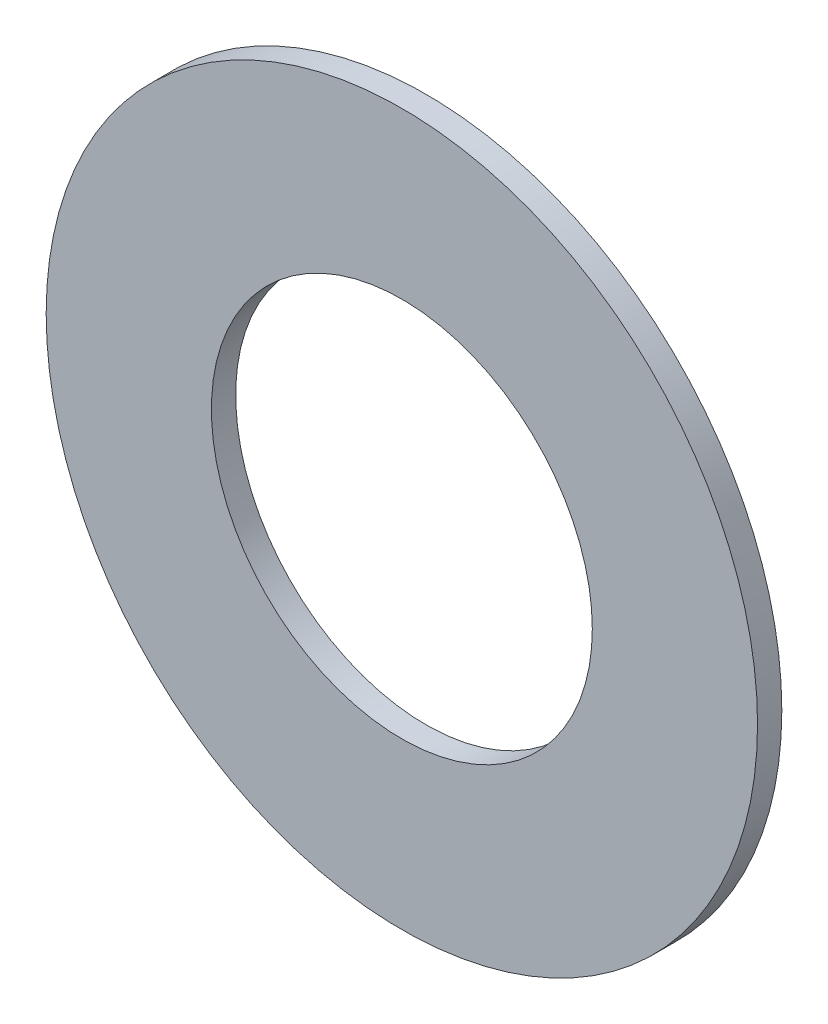
ISO-10303-21;
HEADER;
FILE_DESCRIPTION(('STEP AP214'),'2;1');
FILE_NAME('part.step','',(''),(''),'','','');
FILE_SCHEMA(('AUTOMOTIVE_DESIGN { 1 0 10303 214 1 1 1 1 }'));
ENDSEC;
DATA;
#1=APPLICATION_CONTEXT('core data for automotive mechanical design processes');
#2=APPLICATION_PROTOCOL_DEFINITION('international standard','automotive_design',2000,#1);
#3=PRODUCT_CONTEXT('',#1,'mechanical');
#4=PRODUCT('Part','Part','',(#3));
#5=PRODUCT_RELATED_PRODUCT_CATEGORY('part','',(#4));
#6=PRODUCT_DEFINITION_FORMATION('','',#4);
#7=PRODUCT_DEFINITION_CONTEXT('part definition',#1,'design');
#8=PRODUCT_DEFINITION('design','',#6,#7);
#9=PRODUCT_DEFINITION_SHAPE('','',#8);
#10=(LENGTH_UNIT() NAMED_UNIT(*) SI_UNIT(.MILLI.,.METRE.));
#11=(NAMED_UNIT(*) PLANE_ANGLE_UNIT() SI_UNIT($,.RADIAN.));
#12=(NAMED_UNIT(*) SI_UNIT($,.STERADIAN.) SOLID_ANGLE_UNIT());
#13=UNCERTAINTY_MEASURE_WITH_UNIT(LENGTH_MEASURE(1.E-05),#10,'distance_accuracy_value','');
#14=(GEOMETRIC_REPRESENTATION_CONTEXT(3) GLOBAL_UNCERTAINTY_ASSIGNED_CONTEXT((#13)) GLOBAL_UNIT_ASSIGNED_CONTEXT((#10,
#11,#12)) REPRESENTATION_CONTEXT('',''));
#15=CARTESIAN_POINT('',(0.,0.,0.));
#16=DIRECTION('',(0.,0.,1.));
#17=DIRECTION('',(1.,0.,0.));
#18=AXIS2_PLACEMENT_3D('',#15,#16,#17);
#19=CARTESIAN_POINT('',(0.,0.,-0.406399999999996));
#20=DIRECTION('',(0.,0.,1.));
#21=DIRECTION('',(1.,0.,0.));
#22=AXIS2_PLACEMENT_3D('',#19,#20,#21);
#23=CYLINDRICAL_SURFACE('',#22,11.90625);
#24=CARTESIAN_POINT('',(0.,0.,-0.406399999999996));
#25=DIRECTION('',(0.,0.,1.));
#26=DIRECTION('',(1.,0.,0.));
#27=AXIS2_PLACEMENT_3D('',#24,#25,#26);
#28=CIRCLE('',#27,11.90625);
#29=CARTESIAN_POINT('',(11.90625,0.,-0.406399999999996));
#30=VERTEX_POINT('',#29);
#31=EDGE_CURVE('E10',#30,#30,#28,.T.);
#32=ORIENTED_EDGE('',*,*,#31,.T.);
#33=EDGE_LOOP('',(#32));
#34=FACE_BOUND('',#33,.T.);
#35=CARTESIAN_POINT('',(0.,0.,0.406400000000004));
#36=DIRECTION('',(0.,0.,1.));
#37=DIRECTION('',(1.,0.,0.));
#38=AXIS2_PLACEMENT_3D('',#35,#36,#37);
#39=CIRCLE('',#38,11.90625);
#40=CARTESIAN_POINT('',(11.90625,0.,0.406400000000004));
#41=VERTEX_POINT('',#40);
#42=EDGE_CURVE('E44',#41,#41,#39,.T.);
#43=ORIENTED_EDGE('',*,*,#42,.F.);
#44=EDGE_LOOP('',(#43));
#45=FACE_BOUND('',#44,.T.);
#46=ADVANCED_FACE('F34',(#34,#45),#23,.T.);
#47=CARTESIAN_POINT('',(0.,0.,-0.406399999999996));
#48=DIRECTION('',(0.,0.,1.));
#49=DIRECTION('',(1.,0.,0.));
#50=AXIS2_PLACEMENT_3D('',#47,#48,#49);
#51=PLANE('',#50);
#52=CARTESIAN_POINT('',(0.,0.,-0.406399999999996));
#53=DIRECTION('',(0.,0.,1.));
#54=DIRECTION('',(1.,0.,0.));
#55=AXIS2_PLACEMENT_3D('',#52,#53,#54);
#56=CIRCLE('',#55,6.3754);
#57=CARTESIAN_POINT('',(6.3754,0.,-0.406399999999996));
#58=VERTEX_POINT('',#57);
#59=EDGE_CURVE('E40',#58,#58,#56,.T.);
#60=ORIENTED_EDGE('',*,*,#59,.T.);
#61=EDGE_LOOP('',(#60));
#62=FACE_BOUND('',#61,.T.);
#63=ORIENTED_EDGE('',*,*,#31,.F.);
#64=EDGE_LOOP('',(#63));
#65=FACE_BOUND('',#64,.T.);
#66=ADVANCED_FACE('F63',(#62,#65),#51,.F.);
#67=CARTESIAN_POINT('',(0.,0.,-0.406399999999996));
#68=DIRECTION('',(0.,0.,1.));
#69=DIRECTION('',(1.,0.,0.));
#70=AXIS2_PLACEMENT_3D('',#67,#68,#69);
#71=CYLINDRICAL_SURFACE('',#70,6.3754);
#72=ORIENTED_EDGE('',*,*,#59,.F.);
#73=EDGE_LOOP('',(#72));
#74=FACE_BOUND('',#73,.T.);
#75=CARTESIAN_POINT('',(0.,0.,0.406400000000004));
#76=DIRECTION('',(0.,0.,1.));
#77=DIRECTION('',(1.,0.,0.));
#78=AXIS2_PLACEMENT_3D('',#75,#76,#77);
#79=CIRCLE('',#78,6.3754);
#80=CARTESIAN_POINT('',(6.3754,0.,0.406400000000004));
#81=VERTEX_POINT('',#80);
#82=EDGE_CURVE('E48',#81,#81,#79,.T.);
#83=ORIENTED_EDGE('',*,*,#82,.T.);
#84=EDGE_LOOP('',(#83));
#85=FACE_BOUND('',#84,.T.);
#86=ADVANCED_FACE('F54',(#74,#85),#71,.F.);
#87=CARTESIAN_POINT('',(0.,0.,0.406400000000004));
#88=DIRECTION('',(0.,0.,1.));
#89=DIRECTION('',(1.,0.,0.));
#90=AXIS2_PLACEMENT_3D('',#87,#88,#89);
#91=PLANE('',#90);
#92=ORIENTED_EDGE('',*,*,#42,.T.);
#93=EDGE_LOOP('',(#92));
#94=FACE_BOUND('',#93,.T.);
#95=ORIENTED_EDGE('',*,*,#82,.F.);
#96=EDGE_LOOP('',(#95));
#97=FACE_BOUND('',#96,.T.);
#98=ADVANCED_FACE('F56',(#94,#97),#91,.T.);
#99=CLOSED_SHELL('',(#46,#66,#86,#98));
#100=MANIFOLD_SOLID_BREP('B2',#99);
#101=ADVANCED_BREP_SHAPE_REPRESENTATION('',(#18,#100),#14);
#102=SHAPE_DEFINITION_REPRESENTATION(#9,#101);
ENDSEC;
END-ISO-10303-21;
